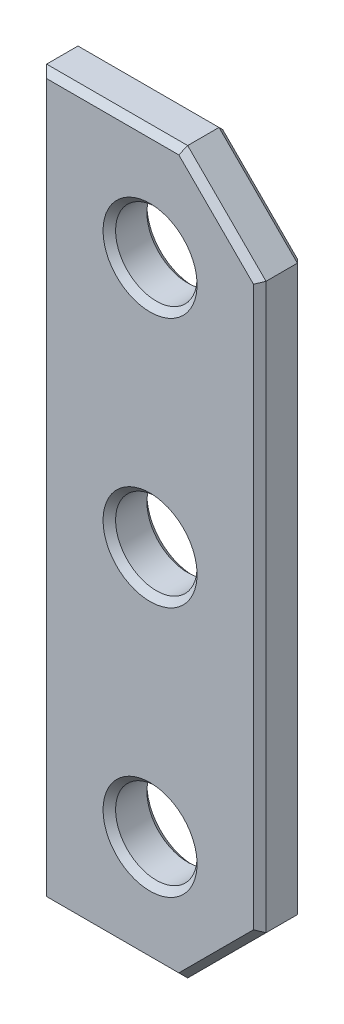
ISO-10303-21;
HEADER;
FILE_DESCRIPTION(('STEP AP214'),'2;1');
FILE_NAME('part.step','',(''),(''),'','','');
FILE_SCHEMA(('AUTOMOTIVE_DESIGN { 1 0 10303 214 1 1 1 1 }'));
ENDSEC;
DATA;
#1=APPLICATION_CONTEXT('core data for automotive mechanical design processes');
#2=APPLICATION_PROTOCOL_DEFINITION('international standard','automotive_design',2000,#1);
#3=PRODUCT_CONTEXT('',#1,'mechanical');
#4=PRODUCT('Part','Part','',(#3));
#5=PRODUCT_RELATED_PRODUCT_CATEGORY('part','',(#4));
#6=PRODUCT_DEFINITION_FORMATION('','',#4);
#7=PRODUCT_DEFINITION_CONTEXT('part definition',#1,'design');
#8=PRODUCT_DEFINITION('design','',#6,#7);
#9=PRODUCT_DEFINITION_SHAPE('','',#8);
#10=(LENGTH_UNIT() NAMED_UNIT(*) SI_UNIT(.MILLI.,.METRE.));
#11=(NAMED_UNIT(*) PLANE_ANGLE_UNIT() SI_UNIT($,.RADIAN.));
#12=(NAMED_UNIT(*) SI_UNIT($,.STERADIAN.) SOLID_ANGLE_UNIT());
#13=UNCERTAINTY_MEASURE_WITH_UNIT(LENGTH_MEASURE(1.E-05),#10,'distance_accuracy_value','');
#14=(GEOMETRIC_REPRESENTATION_CONTEXT(3) GLOBAL_UNCERTAINTY_ASSIGNED_CONTEXT((#13)) GLOBAL_UNIT_ASSIGNED_CONTEXT((#10,
#11,#12)) REPRESENTATION_CONTEXT('',''));
#15=CARTESIAN_POINT('',(0.,0.,0.));
#16=DIRECTION('',(0.,0.,1.));
#17=DIRECTION('',(1.,0.,0.));
#18=AXIS2_PLACEMENT_3D('',#15,#16,#17);
#19=CARTESIAN_POINT('',(0.,230.,14.));
#20=DIRECTION('',(0.,0.,-1.));
#21=DIRECTION('',(-1.,0.,0.));
#22=AXIS2_PLACEMENT_3D('',#19,#20,#21);
#23=PLANE('',#22);
#24=CARTESIAN_POINT('',(35.,195.,14.));
#25=DIRECTION('',(0.,0.,-1.));
#26=DIRECTION('',(-1.,0.,0.));
#27=AXIS2_PLACEMENT_3D('',#24,#25,#26);
#28=CIRCLE('',#27,15.);
#29=CARTESIAN_POINT('',(20.,195.,14.));
#30=VERTEX_POINT('',#29);
#31=EDGE_CURVE('E11',#30,#30,#28,.T.);
#32=ORIENTED_EDGE('',*,*,#31,.T.);
#33=EDGE_LOOP('',(#32));
#34=FACE_BOUND('',#33,.T.);
#35=CARTESIAN_POINT('',(35.,115.,14.));
#36=DIRECTION('',(0.,0.,-1.));
#37=DIRECTION('',(-1.,0.,0.));
#38=AXIS2_PLACEMENT_3D('',#35,#36,#37);
#39=CIRCLE('',#38,15.);
#40=CARTESIAN_POINT('',(20.,115.,14.));
#41=VERTEX_POINT('',#40);
#42=EDGE_CURVE('E44',#41,#41,#39,.T.);
#43=ORIENTED_EDGE('',*,*,#42,.T.);
#44=EDGE_LOOP('',(#43));
#45=FACE_BOUND('',#44,.T.);
#46=CARTESIAN_POINT('',(35.,35.,14.));
#47=DIRECTION('',(0.,0.,-1.));
#48=DIRECTION('',(-1.,0.,0.));
#49=AXIS2_PLACEMENT_3D('',#46,#47,#48);
#50=CIRCLE('',#49,15.);
#51=CARTESIAN_POINT('',(20.,35.,14.));
#52=VERTEX_POINT('',#51);
#53=EDGE_CURVE('E217',#52,#52,#50,.T.);
#54=ORIENTED_EDGE('',*,*,#53,.T.);
#55=EDGE_LOOP('',(#54));
#56=FACE_BOUND('',#55,.T.);
#57=DIRECTION('',(-0.707106781186543,0.707106781186552,0.));
#58=VECTOR('',#57,1.);
#59=CARTESIAN_POINT('',(21.0857864376272,251.085786437627,14.));
#60=LINE('',#59,#58);
#61=CARTESIAN_POINT('',(68.,204.171572875254,14.));
#62=VERTEX_POINT('',#61);
#63=CARTESIAN_POINT('',(44.1715728752538,228.,14.));
#64=VERTEX_POINT('',#63);
#65=EDGE_CURVE('E52',#62,#64,#60,.T.);
#66=ORIENTED_EDGE('',*,*,#65,.T.);
#67=DIRECTION('',(-1.,0.,0.));
#68=VECTOR('',#67,1.);
#69=CARTESIAN_POINT('',(0.,228.,14.));
#70=LINE('',#69,#68);
#71=CARTESIAN_POINT('',(2.,228.,14.));
#72=VERTEX_POINT('',#71);
#73=EDGE_CURVE('E215',#64,#72,#70,.T.);
#74=ORIENTED_EDGE('',*,*,#73,.T.);
#75=DIRECTION('',(0.,-1.,0.));
#76=VECTOR('',#75,1.);
#77=CARTESIAN_POINT('',(2.,230.,14.));
#78=LINE('',#77,#76);
#79=CARTESIAN_POINT('',(2.,2.,14.));
#80=VERTEX_POINT('',#79);
#81=EDGE_CURVE('E207',#72,#80,#78,.T.);
#82=ORIENTED_EDGE('',*,*,#81,.T.);
#83=DIRECTION('',(1.,0.,0.));
#84=VECTOR('',#83,1.);
#85=CARTESIAN_POINT('',(0.,2.,14.));
#86=LINE('',#85,#84);
#87=CARTESIAN_POINT('',(44.1715728752538,2.,14.));
#88=VERTEX_POINT('',#87);
#89=EDGE_CURVE('E209',#80,#88,#86,.T.);
#90=ORIENTED_EDGE('',*,*,#89,.T.);
#91=DIRECTION('',(0.707106781186543,0.707106781186552,0.));
#92=VECTOR('',#91,1.);
#93=CARTESIAN_POINT('',(136.085786437627,93.9142135623746,14.));
#94=LINE('',#93,#92);
#95=CARTESIAN_POINT('',(68.,25.8284271247465,14.));
#96=VERTEX_POINT('',#95);
#97=EDGE_CURVE('E211',#88,#96,#94,.T.);
#98=ORIENTED_EDGE('',*,*,#97,.T.);
#99=DIRECTION('',(0.,1.,0.));
#100=VECTOR('',#99,1.);
#101=CARTESIAN_POINT('',(68.,230.,14.));
#102=LINE('',#101,#100);
#103=EDGE_CURVE('E57',#96,#62,#102,.T.);
#104=ORIENTED_EDGE('',*,*,#103,.T.);
#105=EDGE_LOOP('',(#66,#74,#82,#90,#98,#104));
#106=FACE_BOUND('',#105,.T.);
#107=ADVANCED_FACE('F35',(#34,#45,#56,#106),#23,.F.);
#108=CARTESIAN_POINT('',(0.,230.,0.));
#109=DIRECTION('',(0.,0.,-1.));
#110=DIRECTION('',(-1.,0.,0.));
#111=AXIS2_PLACEMENT_3D('',#108,#109,#110);
#112=PLANE('',#111);
#113=CARTESIAN_POINT('',(35.,195.,0.));
#114=DIRECTION('',(0.,0.,-1.));
#115=DIRECTION('',(-1.,0.,0.));
#116=AXIS2_PLACEMENT_3D('',#113,#114,#115);
#117=CIRCLE('',#116,15.);
#118=CARTESIAN_POINT('',(20.,195.,0.));
#119=VERTEX_POINT('',#118);
#120=EDGE_CURVE('E157',#119,#119,#117,.F.);
#121=ORIENTED_EDGE('',*,*,#120,.T.);
#122=EDGE_LOOP('',(#121));
#123=FACE_BOUND('',#122,.T.);
#124=CARTESIAN_POINT('',(35.,35.,0.));
#125=DIRECTION('',(0.,0.,-1.));
#126=DIRECTION('',(-1.,0.,0.));
#127=AXIS2_PLACEMENT_3D('',#124,#125,#126);
#128=CIRCLE('',#127,15.);
#129=CARTESIAN_POINT('',(20.,35.,0.));
#130=VERTEX_POINT('',#129);
#131=EDGE_CURVE('E154',#130,#130,#128,.F.);
#132=ORIENTED_EDGE('',*,*,#131,.T.);
#133=EDGE_LOOP('',(#132));
#134=FACE_BOUND('',#133,.T.);
#135=DIRECTION('',(-0.707106781186543,-0.707106781186552,0.));
#136=VECTOR('',#135,1.);
#137=CARTESIAN_POINT('',(43.5857864376269,1.4142135623731,0.));
#138=LINE('',#137,#136);
#139=CARTESIAN_POINT('',(68.,25.8284271247465,0.));
#140=VERTEX_POINT('',#139);
#141=CARTESIAN_POINT('',(44.1715728752538,2.,0.));
#142=VERTEX_POINT('',#141);
#143=EDGE_CURVE('E153',#140,#142,#138,.T.);
#144=ORIENTED_EDGE('',*,*,#143,.T.);
#145=DIRECTION('',(-1.,0.,0.));
#146=VECTOR('',#145,1.);
#147=CARTESIAN_POINT('',(0.,2.,0.));
#148=LINE('',#147,#146);
#149=CARTESIAN_POINT('',(2.00000000000001,2.,0.));
#150=VERTEX_POINT('',#149);
#151=EDGE_CURVE('E131',#142,#150,#148,.T.);
#152=ORIENTED_EDGE('',*,*,#151,.T.);
#153=DIRECTION('',(0.,1.,0.));
#154=VECTOR('',#153,1.);
#155=CARTESIAN_POINT('',(2.00000000000001,230.,0.));
#156=LINE('',#155,#154);
#157=CARTESIAN_POINT('',(2.00000000000001,228.,0.));
#158=VERTEX_POINT('',#157);
#159=EDGE_CURVE('E141',#150,#158,#156,.T.);
#160=ORIENTED_EDGE('',*,*,#159,.T.);
#161=DIRECTION('',(1.,0.,0.));
#162=VECTOR('',#161,1.);
#163=CARTESIAN_POINT('',(45.,228.,0.));
#164=LINE('',#163,#162);
#165=CARTESIAN_POINT('',(44.1715728752538,228.,0.));
#166=VERTEX_POINT('',#165);
#167=EDGE_CURVE('E147',#158,#166,#164,.T.);
#168=ORIENTED_EDGE('',*,*,#167,.T.);
#169=DIRECTION('',(0.707106781186543,-0.707106781186552,0.));
#170=VECTOR('',#169,1.);
#171=CARTESIAN_POINT('',(68.5857864376269,203.585786437627,0.));
#172=LINE('',#171,#170);
#173=CARTESIAN_POINT('',(68.,204.171572875254,0.));
#174=VERTEX_POINT('',#173);
#175=EDGE_CURVE('E278',#166,#174,#172,.T.);
#176=ORIENTED_EDGE('',*,*,#175,.T.);
#177=DIRECTION('',(0.,-1.,0.));
#178=VECTOR('',#177,1.);
#179=CARTESIAN_POINT('',(68.,25.0000000000003,0.));
#180=LINE('',#179,#178);
#181=EDGE_CURVE('E159',#174,#140,#180,.T.);
#182=ORIENTED_EDGE('',*,*,#181,.T.);
#183=EDGE_LOOP('',(#144,#152,#160,#168,#176,#182));
#184=FACE_BOUND('',#183,.T.);
#185=CARTESIAN_POINT('',(35.,115.,0.));
#186=DIRECTION('',(0.,0.,-1.));
#187=DIRECTION('',(-1.,0.,0.));
#188=AXIS2_PLACEMENT_3D('',#185,#186,#187);
#189=CIRCLE('',#188,15.);
#190=CARTESIAN_POINT('',(20.,115.,0.));
#191=VERTEX_POINT('',#190);
#192=EDGE_CURVE('E148',#191,#191,#189,.F.);
#193=ORIENTED_EDGE('',*,*,#192,.T.);
#194=EDGE_LOOP('',(#193));
#195=FACE_BOUND('',#194,.T.);
#196=ADVANCED_FACE('F150',(#123,#134,#184,#195),#112,.T.);
#197=CARTESIAN_POINT('',(0.,0.,14.));
#198=DIRECTION('',(1.,0.,0.));
#199=DIRECTION('',(0.,0.,-1.));
#200=AXIS2_PLACEMENT_3D('',#197,#198,#199);
#201=PLANE('',#200);
#202=DIRECTION('',(0.,0.,-1.));
#203=VECTOR('',#202,1.);
#204=CARTESIAN_POINT('',(0.,230.,14.));
#205=LINE('',#204,#203);
#206=CARTESIAN_POINT('',(0.,230.,12.));
#207=VERTEX_POINT('',#206);
#208=CARTESIAN_POINT('',(0.,230.,2.));
#209=VERTEX_POINT('',#208);
#210=EDGE_CURVE('E232',#207,#209,#205,.T.);
#211=ORIENTED_EDGE('',*,*,#210,.T.);
#212=DIRECTION('',(0.,-1.,0.));
#213=VECTOR('',#212,1.);
#214=CARTESIAN_POINT('',(0.,0.,2.));
#215=LINE('',#214,#213);
#216=CARTESIAN_POINT('',(0.,0.,2.));
#217=VERTEX_POINT('',#216);
#218=EDGE_CURVE('E199',#209,#217,#215,.T.);
#219=ORIENTED_EDGE('',*,*,#218,.T.);
#220=DIRECTION('',(0.,0.,-1.));
#221=VECTOR('',#220,1.);
#222=CARTESIAN_POINT('',(0.,0.,14.));
#223=LINE('',#222,#221);
#224=CARTESIAN_POINT('',(0.,0.,12.));
#225=VERTEX_POINT('',#224);
#226=EDGE_CURVE('E268',#225,#217,#223,.T.);
#227=ORIENTED_EDGE('',*,*,#226,.F.);
#228=DIRECTION('',(0.,1.,0.));
#229=VECTOR('',#228,1.);
#230=CARTESIAN_POINT('',(0.,0.,12.));
#231=LINE('',#230,#229);
#232=EDGE_CURVE('E197',#225,#207,#231,.T.);
#233=ORIENTED_EDGE('',*,*,#232,.T.);
#234=EDGE_LOOP('',(#211,#219,#227,#233));
#235=FACE_BOUND('',#234,.T.);
#236=ADVANCED_FACE('F302',(#235),#201,.F.);
#237=CARTESIAN_POINT('',(0.,0.,14.));
#238=DIRECTION('',(0.,1.,0.));
#239=DIRECTION('',(0.,0.,1.));
#240=AXIS2_PLACEMENT_3D('',#237,#238,#239);
#241=PLANE('',#240);
#242=ORIENTED_EDGE('',*,*,#226,.T.);
#243=DIRECTION('',(1.,0.,0.));
#244=VECTOR('',#243,1.);
#245=CARTESIAN_POINT('',(45.,0.,2.));
#246=LINE('',#245,#244);
#247=CARTESIAN_POINT('',(45.,0.,2.));
#248=VERTEX_POINT('',#247);
#249=EDGE_CURVE('E134',#217,#248,#246,.T.);
#250=ORIENTED_EDGE('',*,*,#249,.T.);
#251=DIRECTION('',(0.,0.,-1.));
#252=VECTOR('',#251,1.);
#253=CARTESIAN_POINT('',(45.,0.,14.));
#254=LINE('',#253,#252);
#255=CARTESIAN_POINT('',(45.,0.,12.));
#256=VERTEX_POINT('',#255);
#257=EDGE_CURVE('E261',#256,#248,#254,.T.);
#258=ORIENTED_EDGE('',*,*,#257,.F.);
#259=DIRECTION('',(-1.,0.,0.));
#260=VECTOR('',#259,1.);
#261=CARTESIAN_POINT('',(0.,0.,12.));
#262=LINE('',#261,#260);
#263=EDGE_CURVE('E177',#256,#225,#262,.T.);
#264=ORIENTED_EDGE('',*,*,#263,.T.);
#265=EDGE_LOOP('',(#242,#250,#258,#264));
#266=FACE_BOUND('',#265,.T.);
#267=ADVANCED_FACE('F266',(#266),#241,.F.);
#268=CARTESIAN_POINT('',(45.,0.,14.));
#269=DIRECTION('',(-0.707106781186552,0.707106781186543,0.));
#270=DIRECTION('',(-0.707106781186543,-0.707106781186552,0.));
#271=AXIS2_PLACEMENT_3D('',#268,#269,#270);
#272=PLANE('',#271);
#273=ORIENTED_EDGE('',*,*,#257,.T.);
#274=DIRECTION('',(0.707106781186543,0.707106781186552,0.));
#275=VECTOR('',#274,1.);
#276=CARTESIAN_POINT('',(70.,25.0000000000003,2.));
#277=LINE('',#276,#275);
#278=CARTESIAN_POINT('',(70.,25.0000000000003,2.));
#279=VERTEX_POINT('',#278);
#280=EDGE_CURVE('E182',#248,#279,#277,.T.);
#281=ORIENTED_EDGE('',*,*,#280,.T.);
#282=DIRECTION('',(0.,0.,-1.));
#283=VECTOR('',#282,1.);
#284=CARTESIAN_POINT('',(70.,25.0000000000003,14.));
#285=LINE('',#284,#283);
#286=CARTESIAN_POINT('',(70.,25.0000000000003,12.));
#287=VERTEX_POINT('',#286);
#288=EDGE_CURVE('E263',#287,#279,#285,.T.);
#289=ORIENTED_EDGE('',*,*,#288,.F.);
#290=DIRECTION('',(-0.707106781186543,-0.707106781186552,0.));
#291=VECTOR('',#290,1.);
#292=CARTESIAN_POINT('',(45.,0.,12.));
#293=LINE('',#292,#291);
#294=EDGE_CURVE('E180',#287,#256,#293,.T.);
#295=ORIENTED_EDGE('',*,*,#294,.T.);
#296=EDGE_LOOP('',(#273,#281,#289,#295));
#297=FACE_BOUND('',#296,.T.);
#298=ADVANCED_FACE('F260',(#297),#272,.F.);
#299=CARTESIAN_POINT('',(70.,25.0000000000003,14.));
#300=DIRECTION('',(-1.,0.,0.));
#301=DIRECTION('',(0.,-1.,0.));
#302=AXIS2_PLACEMENT_3D('',#299,#300,#301);
#303=PLANE('',#302);
#304=ORIENTED_EDGE('',*,*,#288,.T.);
#305=DIRECTION('',(0.,1.,0.));
#306=VECTOR('',#305,1.);
#307=CARTESIAN_POINT('',(70.,205.,2.));
#308=LINE('',#307,#306);
#309=CARTESIAN_POINT('',(70.,205.,2.));
#310=VERTEX_POINT('',#309);
#311=EDGE_CURVE('E186',#279,#310,#308,.T.);
#312=ORIENTED_EDGE('',*,*,#311,.T.);
#313=DIRECTION('',(0.,0.,-1.));
#314=VECTOR('',#313,1.);
#315=CARTESIAN_POINT('',(70.,205.,14.));
#316=LINE('',#315,#314);
#317=CARTESIAN_POINT('',(70.,205.,12.));
#318=VERTEX_POINT('',#317);
#319=EDGE_CURVE('E271',#318,#310,#316,.T.);
#320=ORIENTED_EDGE('',*,*,#319,.F.);
#321=DIRECTION('',(0.,-1.,0.));
#322=VECTOR('',#321,1.);
#323=CARTESIAN_POINT('',(70.,25.0000000000003,12.));
#324=LINE('',#323,#322);
#325=EDGE_CURVE('E184',#318,#287,#324,.T.);
#326=ORIENTED_EDGE('',*,*,#325,.T.);
#327=EDGE_LOOP('',(#304,#312,#320,#326));
#328=FACE_BOUND('',#327,.T.);
#329=ADVANCED_FACE('F290',(#328),#303,.F.);
#330=CARTESIAN_POINT('',(45.,230.,14.));
#331=DIRECTION('',(-0.707106781186552,-0.707106781186543,0.));
#332=DIRECTION('',(0.707106781186543,-0.707106781186552,0.));
#333=AXIS2_PLACEMENT_3D('',#330,#331,#332);
#334=PLANE('',#333);
#335=ORIENTED_EDGE('',*,*,#319,.T.);
#336=DIRECTION('',(-0.707106781186543,0.707106781186552,0.));
#337=VECTOR('',#336,1.);
#338=CARTESIAN_POINT('',(45.,230.,2.));
#339=LINE('',#338,#337);
#340=CARTESIAN_POINT('',(45.,230.,2.));
#341=VERTEX_POINT('',#340);
#342=EDGE_CURVE('E190',#310,#341,#339,.T.);
#343=ORIENTED_EDGE('',*,*,#342,.T.);
#344=DIRECTION('',(0.,0.,-1.));
#345=VECTOR('',#344,1.);
#346=CARTESIAN_POINT('',(45.,230.,14.));
#347=LINE('',#346,#345);
#348=CARTESIAN_POINT('',(45.,230.,12.));
#349=VERTEX_POINT('',#348);
#350=EDGE_CURVE('E295',#349,#341,#347,.T.);
#351=ORIENTED_EDGE('',*,*,#350,.F.);
#352=DIRECTION('',(0.707106781186543,-0.707106781186552,0.));
#353=VECTOR('',#352,1.);
#354=CARTESIAN_POINT('',(45.,230.,12.));
#355=LINE('',#354,#353);
#356=EDGE_CURVE('E188',#349,#318,#355,.T.);
#357=ORIENTED_EDGE('',*,*,#356,.T.);
#358=EDGE_LOOP('',(#335,#343,#351,#357));
#359=FACE_BOUND('',#358,.T.);
#360=ADVANCED_FACE('F313',(#359),#334,.F.);
#361=CARTESIAN_POINT('',(0.,230.,14.));
#362=DIRECTION('',(0.,-1.,0.));
#363=DIRECTION('',(0.,0.,-1.));
#364=AXIS2_PLACEMENT_3D('',#361,#362,#363);
#365=PLANE('',#364);
#366=ORIENTED_EDGE('',*,*,#350,.T.);
#367=DIRECTION('',(-1.,0.,0.));
#368=VECTOR('',#367,1.);
#369=CARTESIAN_POINT('',(0.,230.,2.));
#370=LINE('',#369,#368);
#371=EDGE_CURVE('E195',#341,#209,#370,.T.);
#372=ORIENTED_EDGE('',*,*,#371,.T.);
#373=ORIENTED_EDGE('',*,*,#210,.F.);
#374=DIRECTION('',(1.,0.,0.));
#375=VECTOR('',#374,1.);
#376=CARTESIAN_POINT('',(0.,230.,12.));
#377=LINE('',#376,#375);
#378=EDGE_CURVE('E192',#207,#349,#377,.T.);
#379=ORIENTED_EDGE('',*,*,#378,.T.);
#380=EDGE_LOOP('',(#366,#372,#373,#379));
#381=FACE_BOUND('',#380,.T.);
#382=ADVANCED_FACE('F314',(#381),#365,.F.);
#383=CARTESIAN_POINT('',(35.,35.,14.));
#384=DIRECTION('',(0.,0.,-1.));
#385=DIRECTION('',(-1.,0.,0.));
#386=AXIS2_PLACEMENT_3D('',#383,#384,#385);
#387=CYLINDRICAL_SURFACE('',#386,13.);
#388=CARTESIAN_POINT('',(35.,35.,2.00000000000001));
#389=DIRECTION('',(0.,0.,-1.));
#390=DIRECTION('',(-1.,0.,0.));
#391=AXIS2_PLACEMENT_3D('',#388,#389,#390);
#392=CIRCLE('',#391,13.);
#393=CARTESIAN_POINT('',(22.,35.,2.00000000000001));
#394=VERTEX_POINT('',#393);
#395=EDGE_CURVE('E174',#394,#394,#392,.T.);
#396=ORIENTED_EDGE('',*,*,#395,.T.);
#397=EDGE_LOOP('',(#396));
#398=FACE_BOUND('',#397,.T.);
#399=CARTESIAN_POINT('',(35.,35.,12.));
#400=DIRECTION('',(0.,0.,-1.));
#401=DIRECTION('',(-1.,0.,0.));
#402=AXIS2_PLACEMENT_3D('',#399,#400,#401);
#403=CIRCLE('',#402,13.);
#404=CARTESIAN_POINT('',(22.,35.,12.));
#405=VERTEX_POINT('',#404);
#406=EDGE_CURVE('E171',#405,#405,#403,.F.);
#407=ORIENTED_EDGE('',*,*,#406,.T.);
#408=EDGE_LOOP('',(#407));
#409=FACE_BOUND('',#408,.T.);
#410=ADVANCED_FACE('F334',(#398,#409),#387,.F.);
#411=CARTESIAN_POINT('',(35.,115.,14.));
#412=DIRECTION('',(0.,0.,-1.));
#413=DIRECTION('',(-1.,0.,0.));
#414=AXIS2_PLACEMENT_3D('',#411,#412,#413);
#415=CYLINDRICAL_SURFACE('',#414,13.);
#416=CARTESIAN_POINT('',(35.,115.,2.00000000000001));
#417=DIRECTION('',(0.,0.,-1.));
#418=DIRECTION('',(-1.,0.,0.));
#419=AXIS2_PLACEMENT_3D('',#416,#417,#418);
#420=CIRCLE('',#419,13.);
#421=CARTESIAN_POINT('',(22.,115.,2.00000000000001));
#422=VERTEX_POINT('',#421);
#423=EDGE_CURVE('E204',#422,#422,#420,.T.);
#424=ORIENTED_EDGE('',*,*,#423,.T.);
#425=EDGE_LOOP('',(#424));
#426=FACE_BOUND('',#425,.T.);
#427=CARTESIAN_POINT('',(35.,115.,12.));
#428=DIRECTION('',(0.,0.,-1.));
#429=DIRECTION('',(-1.,0.,0.));
#430=AXIS2_PLACEMENT_3D('',#427,#428,#429);
#431=CIRCLE('',#430,13.);
#432=CARTESIAN_POINT('',(22.,115.,12.));
#433=VERTEX_POINT('',#432);
#434=EDGE_CURVE('E201',#433,#433,#431,.F.);
#435=ORIENTED_EDGE('',*,*,#434,.T.);
#436=EDGE_LOOP('',(#435));
#437=FACE_BOUND('',#436,.T.);
#438=ADVANCED_FACE('F456',(#426,#437),#415,.F.);
#439=CARTESIAN_POINT('',(35.,195.,14.));
#440=DIRECTION('',(0.,0.,-1.));
#441=DIRECTION('',(-1.,0.,0.));
#442=AXIS2_PLACEMENT_3D('',#439,#440,#441);
#443=CYLINDRICAL_SURFACE('',#442,13.);
#444=CARTESIAN_POINT('',(35.,195.,2.00000000000001));
#445=DIRECTION('',(0.,0.,-1.));
#446=DIRECTION('',(-1.,0.,0.));
#447=AXIS2_PLACEMENT_3D('',#444,#445,#446);
#448=CIRCLE('',#447,13.);
#449=CARTESIAN_POINT('',(22.,195.,2.00000000000001));
#450=VERTEX_POINT('',#449);
#451=EDGE_CURVE('E168',#450,#450,#448,.T.);
#452=ORIENTED_EDGE('',*,*,#451,.T.);
#453=EDGE_LOOP('',(#452));
#454=FACE_BOUND('',#453,.T.);
#455=CARTESIAN_POINT('',(35.,195.,12.));
#456=DIRECTION('',(0.,0.,-1.));
#457=DIRECTION('',(-1.,0.,0.));
#458=AXIS2_PLACEMENT_3D('',#455,#456,#457);
#459=CIRCLE('',#458,13.);
#460=CARTESIAN_POINT('',(22.,195.,12.));
#461=VERTEX_POINT('',#460);
#462=EDGE_CURVE('E165',#461,#461,#459,.F.);
#463=ORIENTED_EDGE('',*,*,#462,.T.);
#464=EDGE_LOOP('',(#463));
#465=FACE_BOUND('',#464,.T.);
#466=ADVANCED_FACE('F353',(#454,#465),#443,.F.);
#467=CARTESIAN_POINT('',(35.,195.,0.));
#468=DIRECTION('',(0.,0.,-1.));
#469=DIRECTION('',(-1.,0.,0.));
#470=AXIS2_PLACEMENT_3D('',#467,#468,#469);
#471=CONICAL_SURFACE('',#470,15.,0.785398163397447);
#472=ORIENTED_EDGE('',*,*,#451,.F.);
#473=EDGE_LOOP('',(#472));
#474=FACE_BOUND('',#473,.T.);
#475=ORIENTED_EDGE('',*,*,#120,.F.);
#476=EDGE_LOOP('',(#475));
#477=FACE_BOUND('',#476,.T.);
#478=ADVANCED_FACE('F349',(#474,#477),#471,.F.);
#479=CARTESIAN_POINT('',(35.,35.,0.));
#480=DIRECTION('',(0.,0.,-1.));
#481=DIRECTION('',(-1.,0.,0.));
#482=AXIS2_PLACEMENT_3D('',#479,#480,#481);
#483=CONICAL_SURFACE('',#482,15.,0.785398163397445);
#484=ORIENTED_EDGE('',*,*,#395,.F.);
#485=EDGE_LOOP('',(#484));
#486=FACE_BOUND('',#485,.T.);
#487=ORIENTED_EDGE('',*,*,#131,.F.);
#488=EDGE_LOOP('',(#487));
#489=FACE_BOUND('',#488,.T.);
#490=ADVANCED_FACE('F352',(#486,#489),#483,.F.);
#491=CARTESIAN_POINT('',(45.,230.,2.));
#492=DIRECTION('',(0.500000000000001,0.499999999999995,-0.70710678118655));
#493=DIRECTION('',(-0.816496580927726,0.,-0.577350269189625));
#494=AXIS2_PLACEMENT_3D('',#491,#492,#493);
#495=PLANE('',#494);
#496=DIRECTION('',(-0.678598344545848,-0.281084637714822,-0.678598344545846));
#497=VECTOR('',#496,1.);
#498=CARTESIAN_POINT('',(63.2561964152546,202.206625093218,-4.74380358474536));
#499=LINE('',#498,#497);
#500=EDGE_CURVE('E226',#174,#310,#499,.F.);
#501=ORIENTED_EDGE('',*,*,#500,.F.);
#502=ORIENTED_EDGE('',*,*,#175,.F.);
#503=DIRECTION('',(-0.281084637714828,-0.678598344545846,-0.678598344545845));
#504=VECTOR('',#503,1.);
#505=CARTESIAN_POINT('',(41.4446141898326,221.416539357625,-6.58346064237479));
#506=LINE('',#505,#504);
#507=EDGE_CURVE('E229',#341,#166,#506,.T.);
#508=ORIENTED_EDGE('',*,*,#507,.F.);
#509=ORIENTED_EDGE('',*,*,#342,.F.);
#510=EDGE_LOOP('',(#501,#502,#508,#509));
#511=FACE_BOUND('',#510,.T.);
#512=ADVANCED_FACE('F311',(#511),#495,.T.);
#513=CARTESIAN_POINT('',(0.,230.,2.));
#514=DIRECTION('',(0.,0.707106781186547,-0.707106781186548));
#515=DIRECTION('',(0.,0.707106781186548,0.707106781186547));
#516=AXIS2_PLACEMENT_3D('',#513,#514,#515);
#517=PLANE('',#516);
#518=ORIENTED_EDGE('',*,*,#507,.T.);
#519=ORIENTED_EDGE('',*,*,#167,.F.);
#520=DIRECTION('',(0.577350269189627,-0.577350269189625,-0.577350269189625));
#521=VECTOR('',#520,1.);
#522=CARTESIAN_POINT('',(76.6666666666668,153.333333333333,-74.6666666666665));
#523=LINE('',#522,#521);
#524=EDGE_CURVE('E144',#209,#158,#523,.T.);
#525=ORIENTED_EDGE('',*,*,#524,.F.);
#526=ORIENTED_EDGE('',*,*,#371,.F.);
#527=EDGE_LOOP('',(#518,#519,#525,#526));
#528=FACE_BOUND('',#527,.T.);
#529=ADVANCED_FACE('F308',(#528),#517,.T.);
#530=CARTESIAN_POINT('',(70.,25.0000000000003,2.));
#531=DIRECTION('',(0.707106781186547,0.,-0.707106781186549));
#532=DIRECTION('',(-0.707106781186549,0.,-0.707106781186547));
#533=AXIS2_PLACEMENT_3D('',#530,#531,#532);
#534=PLANE('',#533);
#535=ORIENTED_EDGE('',*,*,#500,.T.);
#536=ORIENTED_EDGE('',*,*,#311,.F.);
#537=DIRECTION('',(-0.678598344545847,0.281084637714823,-0.678598344545846));
#538=VECTOR('',#537,1.);
#539=CARTESIAN_POINT('',(70.,25.0000000000003,2.));
#540=LINE('',#539,#538);
#541=EDGE_CURVE('E137',#140,#279,#540,.F.);
#542=ORIENTED_EDGE('',*,*,#541,.F.);
#543=ORIENTED_EDGE('',*,*,#181,.F.);
#544=EDGE_LOOP('',(#535,#536,#542,#543));
#545=FACE_BOUND('',#544,.T.);
#546=ADVANCED_FACE('F285',(#545),#534,.T.);
#547=CARTESIAN_POINT('',(0.,0.,2.));
#548=DIRECTION('',(-0.707106781186546,0.,-0.707106781186549));
#549=DIRECTION('',(-0.707106781186549,0.,0.707106781186546));
#550=AXIS2_PLACEMENT_3D('',#547,#548,#549);
#551=PLANE('',#550);
#552=ORIENTED_EDGE('',*,*,#524,.T.);
#553=ORIENTED_EDGE('',*,*,#159,.F.);
#554=DIRECTION('',(-0.577350269189627,-0.577350269189625,0.577350269189625));
#555=VECTOR('',#554,1.);
#556=CARTESIAN_POINT('',(0.,0.,2.));
#557=LINE('',#556,#555);
#558=EDGE_CURVE('E127',#217,#150,#557,.F.);
#559=ORIENTED_EDGE('',*,*,#558,.F.);
#560=ORIENTED_EDGE('',*,*,#218,.F.);
#561=EDGE_LOOP('',(#552,#553,#559,#560));
#562=FACE_BOUND('',#561,.T.);
#563=ADVANCED_FACE('F142',(#562),#551,.T.);
#564=CARTESIAN_POINT('',(45.,0.,2.));
#565=DIRECTION('',(0.500000000000001,-0.499999999999995,-0.70710678118655));
#566=DIRECTION('',(-0.816496580927726,0.,-0.577350269189625));
#567=AXIS2_PLACEMENT_3D('',#564,#565,#566);
#568=PLANE('',#567);
#569=ORIENTED_EDGE('',*,*,#541,.T.);
#570=ORIENTED_EDGE('',*,*,#280,.F.);
#571=DIRECTION('',(-0.281084637714829,0.678598344545846,-0.678598344545845));
#572=VECTOR('',#571,1.);
#573=CARTESIAN_POINT('',(45.,0.,2.));
#574=LINE('',#573,#572);
#575=EDGE_CURVE('E138',#142,#248,#574,.F.);
#576=ORIENTED_EDGE('',*,*,#575,.F.);
#577=ORIENTED_EDGE('',*,*,#143,.F.);
#578=EDGE_LOOP('',(#569,#570,#576,#577));
#579=FACE_BOUND('',#578,.T.);
#580=ADVANCED_FACE('F288',(#579),#568,.T.);
#581=CARTESIAN_POINT('',(0.,0.,2.));
#582=DIRECTION('',(0.,-0.707106781186547,-0.707106781186548));
#583=DIRECTION('',(0.,0.707106781186548,-0.707106781186547));
#584=AXIS2_PLACEMENT_3D('',#581,#582,#583);
#585=PLANE('',#584);
#586=ORIENTED_EDGE('',*,*,#558,.T.);
#587=ORIENTED_EDGE('',*,*,#151,.F.);
#588=ORIENTED_EDGE('',*,*,#575,.T.);
#589=ORIENTED_EDGE('',*,*,#249,.F.);
#590=EDGE_LOOP('',(#586,#587,#588,#589));
#591=FACE_BOUND('',#590,.T.);
#592=ADVANCED_FACE('F129',(#591),#585,.T.);
#593=CARTESIAN_POINT('',(35.,115.,0.));
#594=DIRECTION('',(0.,0.,-1.));
#595=DIRECTION('',(-1.,0.,0.));
#596=AXIS2_PLACEMENT_3D('',#593,#594,#595);
#597=CONICAL_SURFACE('',#596,15.,0.785398163397446);
#598=ORIENTED_EDGE('',*,*,#423,.F.);
#599=EDGE_LOOP('',(#598));
#600=FACE_BOUND('',#599,.T.);
#601=ORIENTED_EDGE('',*,*,#192,.F.);
#602=EDGE_LOOP('',(#601));
#603=FACE_BOUND('',#602,.T.);
#604=ADVANCED_FACE('F360',(#600,#603),#597,.F.);
#605=CARTESIAN_POINT('',(35.,195.,12.));
#606=DIRECTION('',(0.,0.,1.));
#607=DIRECTION('',(1.,0.,0.));
#608=AXIS2_PLACEMENT_3D('',#605,#606,#607);
#609=CONICAL_SURFACE('',#608,13.,0.78539816339745);
#610=ORIENTED_EDGE('',*,*,#31,.F.);
#611=EDGE_LOOP('',(#610));
#612=FACE_BOUND('',#611,.T.);
#613=ORIENTED_EDGE('',*,*,#462,.F.);
#614=EDGE_LOOP('',(#613));
#615=FACE_BOUND('',#614,.T.);
#616=ADVANCED_FACE('F373',(#612,#615),#609,.F.);
#617=CARTESIAN_POINT('',(35.,115.,12.));
#618=DIRECTION('',(0.,0.,1.));
#619=DIRECTION('',(1.,0.,0.));
#620=AXIS2_PLACEMENT_3D('',#617,#618,#619);
#621=CONICAL_SURFACE('',#620,13.,0.78539816339745);
#622=ORIENTED_EDGE('',*,*,#42,.F.);
#623=EDGE_LOOP('',(#622));
#624=FACE_BOUND('',#623,.T.);
#625=ORIENTED_EDGE('',*,*,#434,.F.);
#626=EDGE_LOOP('',(#625));
#627=FACE_BOUND('',#626,.T.);
#628=ADVANCED_FACE('F377',(#624,#627),#621,.F.);
#629=CARTESIAN_POINT('',(35.,35.,12.));
#630=DIRECTION('',(0.,0.,1.));
#631=DIRECTION('',(1.,0.,0.));
#632=AXIS2_PLACEMENT_3D('',#629,#630,#631);
#633=CONICAL_SURFACE('',#632,13.,0.785398163397451);
#634=ORIENTED_EDGE('',*,*,#53,.F.);
#635=EDGE_LOOP('',(#634));
#636=FACE_BOUND('',#635,.T.);
#637=ORIENTED_EDGE('',*,*,#406,.F.);
#638=EDGE_LOOP('',(#637));
#639=FACE_BOUND('',#638,.T.);
#640=ADVANCED_FACE('F381',(#636,#639),#633,.F.);
#641=CARTESIAN_POINT('',(136.085786437627,93.9142135623746,14.));
#642=DIRECTION('',(-0.500000000000002,0.499999999999996,-0.707106781186549));
#643=DIRECTION('',(-0.816496580927725,0.,0.577350269189627));
#644=AXIS2_PLACEMENT_3D('',#641,#642,#643);
#645=PLANE('',#644);
#646=DIRECTION('',(-0.281084637714829,0.678598344545844,0.678598344545846));
#647=VECTOR('',#646,1.);
#648=CARTESIAN_POINT('',(40.6816399105104,10.4254434952562,22.4254434952563));
#649=LINE('',#648,#647);
#650=EDGE_CURVE('E242',#256,#88,#649,.T.);
#651=ORIENTED_EDGE('',*,*,#650,.F.);
#652=ORIENTED_EDGE('',*,*,#294,.F.);
#653=DIRECTION('',(-0.678598344545846,0.281084637714822,0.678598344545847));
#654=VECTOR('',#653,1.);
#655=CARTESIAN_POINT('',(86.366286825931,18.2208620310115,-4.36628682593103));
#656=LINE('',#655,#654);
#657=EDGE_CURVE('E39',#96,#287,#656,.F.);
#658=ORIENTED_EDGE('',*,*,#657,.F.);
#659=ORIENTED_EDGE('',*,*,#97,.F.);
#660=EDGE_LOOP('',(#651,#652,#658,#659));
#661=FACE_BOUND('',#660,.T.);
#662=ADVANCED_FACE('F37',(#661),#645,.F.);
#663=CARTESIAN_POINT('',(68.,230.,14.));
#664=DIRECTION('',(-0.707106781186548,0.,-0.707106781186547));
#665=DIRECTION('',(-0.707106781186547,0.,0.707106781186548));
#666=AXIS2_PLACEMENT_3D('',#663,#664,#665);
#667=PLANE('',#666);
#668=ORIENTED_EDGE('',*,*,#657,.T.);
#669=ORIENTED_EDGE('',*,*,#325,.F.);
#670=DIRECTION('',(-0.678598344545847,-0.281084637714822,0.678598344545847));
#671=VECTOR('',#670,1.);
#672=CARTESIAN_POINT('',(72.9266063928823,206.212240059659,9.07339360711772));
#673=LINE('',#672,#671);
#674=EDGE_CURVE('E240',#62,#318,#673,.F.);
#675=ORIENTED_EDGE('',*,*,#674,.F.);
#676=ORIENTED_EDGE('',*,*,#103,.F.);
#677=EDGE_LOOP('',(#668,#669,#675,#676));
#678=FACE_BOUND('',#677,.T.);
#679=ADVANCED_FACE('F252',(#678),#667,.F.);
#680=CARTESIAN_POINT('',(0.,2.,14.));
#681=DIRECTION('',(0.,0.707106781186549,-0.707106781186547));
#682=DIRECTION('',(0.,0.707106781186547,0.707106781186549));
#683=AXIS2_PLACEMENT_3D('',#680,#681,#682);
#684=PLANE('',#683);
#685=ORIENTED_EDGE('',*,*,#650,.T.);
#686=ORIENTED_EDGE('',*,*,#89,.F.);
#687=DIRECTION('',(0.577350269189625,0.577350269189625,0.577350269189627));
#688=VECTOR('',#687,1.);
#689=CARTESIAN_POINT('',(77.9999999999998,77.9999999999999,90.0000000000001));
#690=LINE('',#689,#688);
#691=EDGE_CURVE('E237',#225,#80,#690,.T.);
#692=ORIENTED_EDGE('',*,*,#691,.F.);
#693=ORIENTED_EDGE('',*,*,#263,.F.);
#694=EDGE_LOOP('',(#685,#686,#692,#693));
#695=FACE_BOUND('',#694,.T.);
#696=ADVANCED_FACE('F393',(#695),#684,.F.);
#697=CARTESIAN_POINT('',(21.0857864376272,251.085786437627,14.));
#698=DIRECTION('',(-0.500000000000002,-0.499999999999996,-0.707106781186549));
#699=DIRECTION('',(-0.816496580927725,0.,0.577350269189627));
#700=AXIS2_PLACEMENT_3D('',#697,#698,#699);
#701=PLANE('',#700);
#702=ORIENTED_EDGE('',*,*,#674,.T.);
#703=ORIENTED_EDGE('',*,*,#356,.F.);
#704=DIRECTION('',(-0.281084637714828,-0.678598344545845,0.678598344545846));
#705=VECTOR('',#704,1.);
#706=CARTESIAN_POINT('',(46.7510631367815,234.227440373389,7.77255962661066));
#707=LINE('',#706,#705);
#708=EDGE_CURVE('E235',#64,#349,#707,.F.);
#709=ORIENTED_EDGE('',*,*,#708,.F.);
#710=ORIENTED_EDGE('',*,*,#65,.F.);
#711=EDGE_LOOP('',(#702,#703,#709,#710));
#712=FACE_BOUND('',#711,.T.);
#713=ADVANCED_FACE('F390',(#712),#701,.F.);
#714=CARTESIAN_POINT('',(2.,230.,14.));
#715=DIRECTION('',(0.707106781186549,0.,-0.707106781186546));
#716=DIRECTION('',(-0.707106781186546,0.,-0.707106781186549));
#717=AXIS2_PLACEMENT_3D('',#714,#715,#716);
#718=PLANE('',#717);
#719=ORIENTED_EDGE('',*,*,#691,.T.);
#720=ORIENTED_EDGE('',*,*,#81,.F.);
#721=DIRECTION('',(-0.577350269189625,0.577350269189625,-0.577350269189627));
#722=VECTOR('',#721,1.);
#723=CARTESIAN_POINT('',(1.33333333333333,228.666666666667,13.3333333333333));
#724=LINE('',#723,#722);
#725=EDGE_CURVE('E233',#207,#72,#724,.F.);
#726=ORIENTED_EDGE('',*,*,#725,.F.);
#727=ORIENTED_EDGE('',*,*,#232,.F.);
#728=EDGE_LOOP('',(#719,#720,#726,#727));
#729=FACE_BOUND('',#728,.T.);
#730=ADVANCED_FACE('F322',(#729),#718,.F.);
#731=CARTESIAN_POINT('',(0.,228.,14.));
#732=DIRECTION('',(0.,-0.707106781186549,-0.707106781186547));
#733=DIRECTION('',(0.,0.707106781186547,-0.707106781186549));
#734=AXIS2_PLACEMENT_3D('',#731,#732,#733);
#735=PLANE('',#734);
#736=ORIENTED_EDGE('',*,*,#708,.T.);
#737=ORIENTED_EDGE('',*,*,#378,.F.);
#738=ORIENTED_EDGE('',*,*,#725,.T.);
#739=ORIENTED_EDGE('',*,*,#73,.F.);
#740=EDGE_LOOP('',(#736,#737,#738,#739));
#741=FACE_BOUND('',#740,.T.);
#742=ADVANCED_FACE('F317',(#741),#735,.F.);
#743=CLOSED_SHELL('',(#107,#196,#236,#267,#298,#329,#360,#382,#410,#438,#466,#478,#490,#512,
#529,#546,#563,#580,#592,#604,#616,#628,#640,#662,#679,#696,#713,#730,#742));
#744=MANIFOLD_SOLID_BREP('B2',#743);
#745=ADVANCED_BREP_SHAPE_REPRESENTATION('',(#18,#744),#14);
#746=SHAPE_DEFINITION_REPRESENTATION(#9,#745);
ENDSEC;
END-ISO-10303-21;
